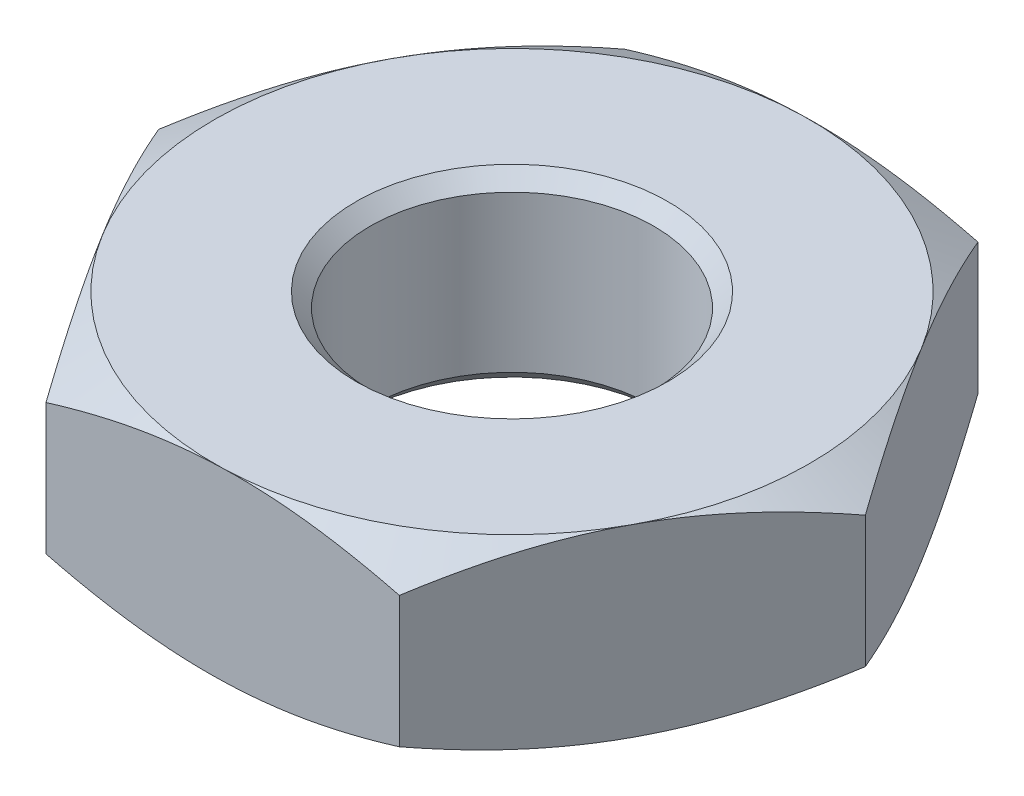
ISO-10303-21;
HEADER;
FILE_DESCRIPTION(('STEP AP214'),'2;1');
FILE_NAME('part.step','',(''),(''),'','','');
FILE_SCHEMA(('AUTOMOTIVE_DESIGN { 1 0 10303 214 1 1 1 1 }'));
ENDSEC;
DATA;
#1=APPLICATION_CONTEXT('core data for automotive mechanical design processes');
#2=APPLICATION_PROTOCOL_DEFINITION('international standard','automotive_design',2000,#1);
#3=PRODUCT_CONTEXT('',#1,'mechanical');
#4=PRODUCT('Part','Part','',(#3));
#5=PRODUCT_RELATED_PRODUCT_CATEGORY('part','',(#4));
#6=PRODUCT_DEFINITION_FORMATION('','',#4);
#7=PRODUCT_DEFINITION_CONTEXT('part definition',#1,'design');
#8=PRODUCT_DEFINITION('design','',#6,#7);
#9=PRODUCT_DEFINITION_SHAPE('','',#8);
#10=(LENGTH_UNIT() NAMED_UNIT(*) SI_UNIT(.MILLI.,.METRE.));
#11=(NAMED_UNIT(*) PLANE_ANGLE_UNIT() SI_UNIT($,.RADIAN.));
#12=(NAMED_UNIT(*) SI_UNIT($,.STERADIAN.) SOLID_ANGLE_UNIT());
#13=UNCERTAINTY_MEASURE_WITH_UNIT(LENGTH_MEASURE(1.E-05),#10,'distance_accuracy_value','');
#14=(GEOMETRIC_REPRESENTATION_CONTEXT(3) GLOBAL_UNCERTAINTY_ASSIGNED_CONTEXT((#13)) GLOBAL_UNIT_ASSIGNED_CONTEXT((#10,
#11,#12)) REPRESENTATION_CONTEXT('',''));
#15=CARTESIAN_POINT('',(0.,0.,0.));
#16=DIRECTION('',(0.,0.,1.));
#17=DIRECTION('',(1.,0.,0.));
#18=AXIS2_PLACEMENT_3D('',#15,#16,#17);
#19=CARTESIAN_POINT('',(2.4239218822574,1.3,-0.0678432657951606));
#20=DIRECTION('',(-0.851697340888521,0.,0.524034006075391));
#21=DIRECTION('',(0.524034006075391,0.,0.851697340888521));
#22=AXIS2_PLACEMENT_3D('',#19,#20,#21);
#23=PLANE('',#22);
#24=CARTESIAN_POINT('',(1.15308389308313,0.187632227821777,-2.13329955972148));
#25=CARTESIAN_POINT('',(1.20892619543021,0.156856982439616,-2.04254067791857));
#26=CARTESIAN_POINT('',(1.26525052314874,0.12886765707169,-1.95099837419582));
#27=CARTESIAN_POINT('',(1.37887456591577,0.0800111785491224,-1.76632849788295));
#28=CARTESIAN_POINT('',(1.43617630044045,0.0591613104543432,-1.67319764309649));
#29=CARTESIAN_POINT('',(1.55006959544779,0.0267043172456262,-1.48809015889092));
#30=CARTESIAN_POINT('',(1.60664362843955,0.0148811929434916,-1.39614201639674));
#31=CARTESIAN_POINT('',(1.72005799914741,0.000764873291671733,-1.21181291402827));
#32=CARTESIAN_POINT('',(1.77689792442088,-0.00154000950645407,-1.11943262448508));
#33=CARTESIAN_POINT('',(1.88311344656104,0.00324580729485996,-0.946803602858488));
#34=CARTESIAN_POINT('',(1.93250491470802,0.00916142377627841,-0.86652907564142));
#35=CARTESIAN_POINT('',(2.03096605411573,0.0279132957265613,-0.706503028396065));
#36=CARTESIAN_POINT('',(2.08003538462258,0.040755961621614,-0.626752062185187));
#37=CARTESIAN_POINT('',(2.17869965888487,0.0728627500989018,-0.466395865725309));
#38=CARTESIAN_POINT('',(2.228282110189,0.0922630208018984,-0.385810939096732));
#39=CARTESIAN_POINT('',(2.32670734985389,0.136294435017617,-0.225843238666911));
#40=CARTESIAN_POINT('',(2.37555139994362,0.160915227486347,-0.146458414214007));
#41=CARTESIAN_POINT('',(2.42404493864866,0.187632227821777,-0.0676432657951605));
#42=B_SPLINE_CURVE_WITH_KNOTS('',3,(#24,#25,#26,#27,#28,#29,#30,#31,#32,#33,#34,#35,#36,#37,#38,
#39,#40,#41),.UNSPECIFIED.,.F.,.F.,(4,2,2,2,2,2,2,2,4),(0.,0.332882891261358,0.666566106457793,
0.991990127789948,1.31701444194562,1.60005859888884,1.88336514093234,2.17295727111776,
2.46198049081544),.UNSPECIFIED.);
#43=CARTESIAN_POINT('',(1.15320694947439,0.187564434701791,-2.13309955972148));
#44=VERTEX_POINT('',#43);
#45=CARTESIAN_POINT('',(1.78856441586589,0.,-1.10047141275832));
#46=VERTEX_POINT('',#45);
#47=EDGE_CURVE('E50',#44,#46,#42,.T.);
#48=ORIENTED_EDGE('',*,*,#47,.F.);
#49=DIRECTION('',(0.,-1.,0.));
#50=VECTOR('',#49,1.);
#51=CARTESIAN_POINT('',(1.15320694947439,1.3,-2.13309955972148));
#52=LINE('',#51,#50);
#53=CARTESIAN_POINT('',(1.15320694947439,1.11243556529821,-2.13309955972148));
#54=VERTEX_POINT('',#53);
#55=EDGE_CURVE('E302',#54,#44,#52,.T.);
#56=ORIENTED_EDGE('',*,*,#55,.F.);
#57=CARTESIAN_POINT('',(2.42404493864866,1.11236777217822,-0.0676432657951605));
#58=CARTESIAN_POINT('',(2.36820263630158,1.14314301756038,-0.15840214759807));
#59=CARTESIAN_POINT('',(2.31187830858305,1.17113234292831,-0.249944451320817));
#60=CARTESIAN_POINT('',(2.19825426581602,1.21998882145088,-0.434614327633695));
#61=CARTESIAN_POINT('',(2.14095253129134,1.24083868954566,-0.527745182420155));
#62=CARTESIAN_POINT('',(2.027059236284,1.27329568275437,-0.712852666625722));
#63=CARTESIAN_POINT('',(1.97048520329225,1.28511880705651,-0.804800809119904));
#64=CARTESIAN_POINT('',(1.85707083258438,1.29923512670833,-0.989129911488374));
#65=CARTESIAN_POINT('',(1.80023090731091,1.30154000950645,-1.08151020103156));
#66=CARTESIAN_POINT('',(1.69401538517075,1.29675419270514,-1.25413922265815));
#67=CARTESIAN_POINT('',(1.64462391702377,1.29083857622372,-1.33441374987522));
#68=CARTESIAN_POINT('',(1.54616277761606,1.27208670427344,-1.49443979712058));
#69=CARTESIAN_POINT('',(1.49709344710921,1.25924403837839,-1.57419076333145));
#70=CARTESIAN_POINT('',(1.39842917284693,1.2271372499011,-1.73454695979133));
#71=CARTESIAN_POINT('',(1.34884672154279,1.2077369791981,-1.81513188641991));
#72=CARTESIAN_POINT('',(1.2504214818779,1.16370556498238,-1.97509958684973));
#73=CARTESIAN_POINT('',(1.20157743178817,1.13908477251365,-2.05448441130263));
#74=CARTESIAN_POINT('',(1.15308389308313,1.11236777217822,-2.13329955972148));
#75=B_SPLINE_CURVE_WITH_KNOTS('',3,(#57,#58,#59,#60,#61,#62,#63,#64,#65,#66,#67,#68,#69,#70,#71,
#72,#73,#74),.UNSPECIFIED.,.F.,.F.,(4,2,2,2,2,2,2,2,4),(0.,0.332882891261357,0.666566106457793,
0.991990127789948,1.31701444194562,1.60005859888884,1.88336514093234,2.17295727111776,
2.46198049081544),.UNSPECIFIED.);
#76=CARTESIAN_POINT('',(1.78856441586589,1.3,-1.10047141275832));
#77=VERTEX_POINT('',#76);
#78=EDGE_CURVE('E246',#77,#54,#75,.T.);
#79=ORIENTED_EDGE('',*,*,#78,.F.);
#80=CARTESIAN_POINT('',(2.4239218822574,1.11243556529821,-0.0678432657951606));
#81=VERTEX_POINT('',#80);
#82=EDGE_CURVE('E315',#81,#77,#75,.T.);
#83=ORIENTED_EDGE('',*,*,#82,.F.);
#84=DIRECTION('',(0.,-1.,0.));
#85=VECTOR('',#84,1.);
#86=CARTESIAN_POINT('',(2.4239218822574,1.3,-0.0678432657951606));
#87=LINE('',#86,#85);
#88=CARTESIAN_POINT('',(2.4239218822574,0.187564434701791,-0.0678432657951605));
#89=VERTEX_POINT('',#88);
#90=EDGE_CURVE('E313',#81,#89,#87,.T.);
#91=ORIENTED_EDGE('',*,*,#90,.T.);
#92=EDGE_CURVE('E137',#46,#89,#42,.T.);
#93=ORIENTED_EDGE('',*,*,#92,.F.);
#94=EDGE_LOOP('',(#48,#56,#79,#83,#91,#93));
#95=FACE_BOUND('',#94,.T.);
#96=ADVANCED_FACE('F35',(#95),#23,.F.);
#97=CARTESIAN_POINT('',(1.15320694947439,1.3,-2.13309955972148));
#98=DIRECTION('',(0.0279780912639564,0.,0.999608536582809));
#99=DIRECTION('',(0.999608536582809,0.,-0.0279780912639564));
#100=AXIS2_PLACEMENT_3D('',#97,#98,#99);
#101=PLANE('',#100);
#102=CARTESIAN_POINT('',(-1.27091493278301,0.187622195912791,-2.06525069611673));
#103=CARTESIAN_POINT('',(-1.1643948705702,0.156847774379668,-2.06823209124589));
#104=CARTESIAN_POINT('',(-1.05695533614888,0.12885932408249,-2.07123922152678));
#105=CARTESIAN_POINT('',(-0.840215748517673,0.0800046617689156,-2.07730555623815));
#106=CARTESIAN_POINT('',(-0.730911843480261,0.0591557336704143,-2.08036486847762));
#107=CARTESIAN_POINT('',(-0.51365868327104,0.0267005987689807,-2.08644557759651));
#108=CARTESIAN_POINT('',(-0.405742859662847,0.0148783984471731,-2.08946603875829));
#109=CARTESIAN_POINT('',(-0.189403301048406,0.000763864689388722,-2.09552117703833));
#110=CARTESIAN_POINT('',(-0.0809803526426981,-0.00154015543921084,-2.09855583214039));
#111=CARTESIAN_POINT('',(0.121622656128498,0.00324702501461745,-2.10422649746817));
#112=CARTESIAN_POINT('',(0.215833009454636,0.00916280861096438,-2.10686335556502));
#113=CARTESIAN_POINT('',(0.403639921550835,0.0279142285983228,-2.11211989223346));
#114=CARTESIAN_POINT('',(0.497235830488684,0.0407562736188154,-2.11473955261686));
#115=CARTESIAN_POINT('',(0.685430122960412,0.0728611238005162,-2.1200069316932));
#116=CARTESIAN_POINT('',(0.780004681366293,0.0922600521344988,-2.12265398354349));
#117=CARTESIAN_POINT('',(0.96774305037703,0.13628827152943,-2.12790860175622));
#118=CARTESIAN_POINT('',(1.06090926713312,0.160907214081484,-2.13051623546454));
#119=CARTESIAN_POINT('',(1.15340694947439,0.187622195912791,-2.13310515753107));
#120=B_SPLINE_CURVE_WITH_KNOTS('',3,(#102,#103,#104,#105,#106,#107,#108,#109,#110,#111,#112,
#113,#114,#115,#116,#117,#118,#119),.UNSPECIFIED.,.F.,.F.,(4,2,2,2,2,2,2,2,4),(0.,
0.332880511908961,0.666561282594564,0.9919831519132,1.31700534002341,1.60003412037819,
1.88332522783748,2.17290110651847,2.46190819001168),.UNSPECIFIED.);
#121=CARTESIAN_POINT('',(-1.27071493278301,0.187564434701791,-2.06525629392632));
#122=VERTEX_POINT('',#121);
#123=CARTESIAN_POINT('',(-0.0587539916543081,0.,-2.09917792682389));
#124=VERTEX_POINT('',#123);
#125=EDGE_CURVE('E58',#122,#124,#120,.T.);
#126=ORIENTED_EDGE('',*,*,#125,.F.);
#127=DIRECTION('',(0.,-1.,0.));
#128=VECTOR('',#127,1.);
#129=CARTESIAN_POINT('',(-1.27071493278301,1.3,-2.06525629392632));
#130=LINE('',#129,#128);
#131=CARTESIAN_POINT('',(-1.27071493278301,1.11243556529821,-2.06525629392632));
#132=VERTEX_POINT('',#131);
#133=EDGE_CURVE('E305',#132,#122,#130,.T.);
#134=ORIENTED_EDGE('',*,*,#133,.F.);
#135=CARTESIAN_POINT('',(1.15340694947439,1.11237780408721,-2.13310515753107));
#136=CARTESIAN_POINT('',(1.04688688726158,1.14315222562033,-2.13012376240191));
#137=CARTESIAN_POINT('',(0.939447352840265,1.17114067591751,-2.12711663212102));
#138=CARTESIAN_POINT('',(0.722707765209056,1.21999533823108,-2.12105029740965));
#139=CARTESIAN_POINT('',(0.613403860171644,1.24084426632959,-2.11799098517018));
#140=CARTESIAN_POINT('',(0.396150699962423,1.27329940123102,-2.11191027605129));
#141=CARTESIAN_POINT('',(0.28823487635423,1.28512160155283,-2.10888981488951));
#142=CARTESIAN_POINT('',(0.0718953177397893,1.29923613531061,-2.10283467660947));
#143=CARTESIAN_POINT('',(-0.0365276306659187,1.30154015543921,-2.09980002150741));
#144=CARTESIAN_POINT('',(-0.239130639437114,1.29675297498538,-2.09412935617963));
#145=CARTESIAN_POINT('',(-0.333340992763253,1.29083719138904,-2.09149249808278));
#146=CARTESIAN_POINT('',(-0.521147904859451,1.27208577140168,-2.08623596141434));
#147=CARTESIAN_POINT('',(-0.614743813797301,1.25924372638118,-2.08361630103094));
#148=CARTESIAN_POINT('',(-0.802938106269029,1.22713887619948,-2.0783489219546));
#149=CARTESIAN_POINT('',(-0.897512664674909,1.2077399478655,-2.07570187010431));
#150=CARTESIAN_POINT('',(-1.08525103368565,1.16371172847057,-2.07044725189158));
#151=CARTESIAN_POINT('',(-1.17841725044174,1.13909278591852,-2.06783961818326));
#152=CARTESIAN_POINT('',(-1.27091493278301,1.11237780408721,-2.06525069611673));
#153=B_SPLINE_CURVE_WITH_KNOTS('',3,(#135,#136,#137,#138,#139,#140,#141,#142,#143,#144,#145,
#146,#147,#148,#149,#150,#151,#152),.UNSPECIFIED.,.F.,.F.,(4,2,2,2,2,2,2,2,4),(0.,
0.332880511908961,0.666561282594564,0.9919831519132,1.31700534002341,1.60003412037819,
1.88332522783748,2.17290110651847,2.46190819001168),.UNSPECIFIED.);
#154=CARTESIAN_POINT('',(-0.0587539916543084,1.3,-2.0991779268239));
#155=VERTEX_POINT('',#154);
#156=EDGE_CURVE('E240',#155,#132,#153,.T.);
#157=ORIENTED_EDGE('',*,*,#156,.F.);
#158=EDGE_CURVE('E245',#54,#155,#153,.T.);
#159=ORIENTED_EDGE('',*,*,#158,.F.);
#160=ORIENTED_EDGE('',*,*,#55,.T.);
#161=EDGE_CURVE('E164',#124,#44,#120,.T.);
#162=ORIENTED_EDGE('',*,*,#161,.F.);
#163=EDGE_LOOP('',(#126,#134,#157,#159,#160,#162));
#164=FACE_BOUND('',#163,.T.);
#165=ADVANCED_FACE('F251',(#164),#101,.F.);
#166=CARTESIAN_POINT('',(-1.27071493278301,1.3,-2.06525629392632));
#167=DIRECTION('',(0.879675432152478,0.,0.475574530507419));
#168=DIRECTION('',(0.475574530507419,0.,-0.879675432152478));
#169=AXIS2_PLACEMENT_3D('',#166,#167,#168);
#170=PLANE('',#169);
#171=CARTESIAN_POINT('',(-2.4240300072574,0.187630071508909,0.0680432657951608));
#172=CARTESIAN_POINT('',(-2.3733517211191,0.156855003207588,-0.0256969166571895));
#173=CARTESIAN_POINT('',(-2.32223598476669,0.128865865930236,-0.120246255574942));
#174=CARTESIAN_POINT('',(-2.2191193285457,0.0800097777897679,-0.310982267081977));
#175=CARTESIAN_POINT('',(-2.16711657598826,0.0591601117410563,-0.407172329615978));
#176=CARTESIAN_POINT('',(-2.06375556971956,0.0267035179636209,-0.598360318089878));
#177=CARTESIAN_POINT('',(-2.01241322239942,0.0148805922652686,-0.693328821803427));
#178=CARTESIAN_POINT('',(-1.90948685661841,0.000764656480634456,-0.883712850993748));
#179=CARTESIAN_POINT('',(-1.8579032124452,-0.00154004089162805,-0.979127684146513));
#180=CARTESIAN_POINT('',(-1.761510455679,0.0032460690250231,-1.15742642498573));
#181=CARTESIAN_POINT('',(-1.71668693763648,0.00916172143131204,-1.24033697859039));
#182=CARTESIAN_POINT('',(-1.62733193638672,0.0279134962403989,-1.40561790575758));
#183=CARTESIAN_POINT('',(-1.58280076240565,0.0407560286831647,-1.48798770734107));
#184=CARTESIAN_POINT('',(-1.4932614216795,0.0728624005347126,-1.65360960926228));
#185=CARTESIAN_POINT('',(-1.44826459169465,0.0922623827015824,-1.73684073987009));
#186=CARTESIAN_POINT('',(-1.35894217688078,0.136293110204638,-1.90206139154893));
#187=CARTESIAN_POINT('',(-1.31461544706421,0.160913505041771,-1.984053030516));
#188=CARTESIAN_POINT('',(-1.27060680778301,0.18763007150891,-2.06545629392632));
#189=B_SPLINE_CURVE_WITH_KNOTS('',3,(#171,#172,#173,#174,#175,#176,#177,#178,#179,#180,#181,
#182,#183,#184,#185,#186,#187,#188),.UNSPECIFIED.,.F.,.F.,(4,2,2,2,2,2,2,2,4),(0.,
0.332882379830728,0.666565069591033,0.991988628357672,1.31701248552958,1.60005333737767,
1.88335656185959,2.17294519888667,2.46196495021022),.UNSPECIFIED.);
#190=CARTESIAN_POINT('',(-2.4239218822574,0.18756443470179,0.0678432657951609));
#191=VERTEX_POINT('',#190);
#192=CARTESIAN_POINT('',(-1.84731840752019,0.,-0.998706514065575));
#193=VERTEX_POINT('',#192);
#194=EDGE_CURVE('E347',#191,#193,#189,.T.);
#195=ORIENTED_EDGE('',*,*,#194,.F.);
#196=DIRECTION('',(0.,-1.,0.));
#197=VECTOR('',#196,1.);
#198=CARTESIAN_POINT('',(-2.4239218822574,1.3,0.0678432657951608));
#199=LINE('',#198,#197);
#200=CARTESIAN_POINT('',(-2.4239218822574,1.11243556529821,0.0678432657951608));
#201=VERTEX_POINT('',#200);
#202=EDGE_CURVE('E308',#201,#191,#199,.T.);
#203=ORIENTED_EDGE('',*,*,#202,.F.);
#204=CARTESIAN_POINT('',(-1.27060680778301,1.11236992849109,-2.06545629392632));
#205=CARTESIAN_POINT('',(-1.32128509392131,1.14314499679241,-1.97171611147397));
#206=CARTESIAN_POINT('',(-1.37240083027372,1.17113413406976,-1.87716677255622));
#207=CARTESIAN_POINT('',(-1.4755174864947,1.21999022221023,-1.68643076104918));
#208=CARTESIAN_POINT('',(-1.52752023905215,1.24083988825894,-1.59024069851518));
#209=CARTESIAN_POINT('',(-1.63088124532085,1.27329648203638,-1.39905271004128));
#210=CARTESIAN_POINT('',(-1.68222359264098,1.28511940773473,-1.30408420632773));
#211=CARTESIAN_POINT('',(-1.785149958422,1.29923534351937,-1.11370017713741));
#212=CARTESIAN_POINT('',(-1.83673360259521,1.30154004089163,-1.01828534398465));
#213=CARTESIAN_POINT('',(-1.93312635936141,1.29675393097498,-0.839986603145431));
#214=CARTESIAN_POINT('',(-1.97794987740392,1.29083827856869,-0.757076049540771));
#215=CARTESIAN_POINT('',(-2.06730487865369,1.2720865037596,-0.591795122373575));
#216=CARTESIAN_POINT('',(-2.11183605263475,1.25924397131684,-0.509425320790095));
#217=CARTESIAN_POINT('',(-2.20137539336091,1.22713759946529,-0.343803418868875));
#218=CARTESIAN_POINT('',(-2.24637222334576,1.20773761729842,-0.260572288261066));
#219=CARTESIAN_POINT('',(-2.33569463815962,1.16370688979536,-0.095351636582233));
#220=CARTESIAN_POINT('',(-2.3800213679762,1.13908649495823,-0.0133599976151586));
#221=CARTESIAN_POINT('',(-2.4240300072574,1.11236992849109,0.0680432657951605));
#222=B_SPLINE_CURVE_WITH_KNOTS('',3,(#204,#205,#206,#207,#208,#209,#210,#211,#212,#213,#214,
#215,#216,#217,#218,#219,#220,#221),.UNSPECIFIED.,.F.,.F.,(4,2,2,2,2,2,2,2,4),(0.,
0.332882379830727,0.666565069591033,0.991988628357672,1.31701248552958,1.60005333737767,
1.88335656185959,2.17294519888667,2.46196495021022),.UNSPECIFIED.);
#223=CARTESIAN_POINT('',(-1.8473184075202,1.3,-0.99870651406558));
#224=VERTEX_POINT('',#223);
#225=EDGE_CURVE('E234',#224,#201,#222,.T.);
#226=ORIENTED_EDGE('',*,*,#225,.F.);
#227=EDGE_CURVE('E239',#132,#224,#222,.T.);
#228=ORIENTED_EDGE('',*,*,#227,.F.);
#229=ORIENTED_EDGE('',*,*,#133,.T.);
#230=EDGE_CURVE('E197',#193,#122,#189,.T.);
#231=ORIENTED_EDGE('',*,*,#230,.F.);
#232=EDGE_LOOP('',(#195,#203,#226,#228,#229,#231));
#233=FACE_BOUND('',#232,.T.);
#234=ADVANCED_FACE('F217',(#233),#170,.F.);
#235=CARTESIAN_POINT('',(-2.4239218822574,1.3,0.0678432657951608));
#236=DIRECTION('',(0.851697340888521,0.,-0.524034006075391));
#237=DIRECTION('',(-0.524034006075391,0.,-0.851697340888521));
#238=AXIS2_PLACEMENT_3D('',#235,#236,#237);
#239=PLANE('',#238);
#240=CARTESIAN_POINT('',(-1.15308389308313,0.187632227821777,2.13329955972148));
#241=CARTESIAN_POINT('',(-1.20892619543021,0.156856982439616,2.04254067791857));
#242=CARTESIAN_POINT('',(-1.26525052314873,0.12886765707169,1.95099837419583));
#243=CARTESIAN_POINT('',(-1.37887456591577,0.0800111785491222,1.76632849788295));
#244=CARTESIAN_POINT('',(-1.43617630044045,0.0591613104543428,1.67319764309649));
#245=CARTESIAN_POINT('',(-1.55006959544779,0.0267043172456258,1.48809015889092));
#246=CARTESIAN_POINT('',(-1.60664362843954,0.0148811929434913,1.39614201639674));
#247=CARTESIAN_POINT('',(-1.7200579991474,0.000764873291671378,1.21181291402827));
#248=CARTESIAN_POINT('',(-1.77689792442088,-0.00154000950645462,1.11943262448509));
#249=CARTESIAN_POINT('',(-1.88311344656104,0.00324580729485926,0.946803602858489));
#250=CARTESIAN_POINT('',(-1.93250491470802,0.00916142377627775,0.866529075641421));
#251=CARTESIAN_POINT('',(-2.03096605411573,0.0279132957265606,0.706503028396065));
#252=CARTESIAN_POINT('',(-2.08003538462258,0.0407559616216133,0.626752062185187));
#253=CARTESIAN_POINT('',(-2.17869965888486,0.0728627500989012,0.466395865725309));
#254=CARTESIAN_POINT('',(-2.228282110189,0.0922630208018979,0.385810939096733));
#255=CARTESIAN_POINT('',(-2.32670734985389,0.136294435017617,0.225843238666911));
#256=CARTESIAN_POINT('',(-2.37555139994362,0.160915227486347,0.146458414214007));
#257=CARTESIAN_POINT('',(-2.42404493864866,0.187632227821777,0.0676432657951609));
#258=B_SPLINE_CURVE_WITH_KNOTS('',3,(#240,#241,#242,#243,#244,#245,#246,#247,#248,#249,#250,
#251,#252,#253,#254,#255,#256,#257),.UNSPECIFIED.,.F.,.F.,(4,2,2,2,2,2,2,2,4),(0.,
0.332882891261358,0.666566106457793,0.991990127789948,1.31701444194562,1.60005859888884,
1.88336514093234,2.17295727111776,2.46198049081544),.UNSPECIFIED.);
#259=CARTESIAN_POINT('',(-1.15320694947439,0.187564434701791,2.13309955972148));
#260=VERTEX_POINT('',#259);
#261=CARTESIAN_POINT('',(-1.78856441586589,0.,1.10047141275832));
#262=VERTEX_POINT('',#261);
#263=EDGE_CURVE('E147',#260,#262,#258,.T.);
#264=ORIENTED_EDGE('',*,*,#263,.F.);
#265=DIRECTION('',(0.,-1.,0.));
#266=VECTOR('',#265,1.);
#267=CARTESIAN_POINT('',(-1.15320694947439,1.3,2.13309955972148));
#268=LINE('',#267,#266);
#269=CARTESIAN_POINT('',(-1.15320694947439,1.11243556529821,2.13309955972148));
#270=VERTEX_POINT('',#269);
#271=EDGE_CURVE('E163',#270,#260,#268,.T.);
#272=ORIENTED_EDGE('',*,*,#271,.F.);
#273=CARTESIAN_POINT('',(-2.42404493864866,1.11236777217822,0.0676432657951608));
#274=CARTESIAN_POINT('',(-2.36820263630158,1.14314301756038,0.15840214759807));
#275=CARTESIAN_POINT('',(-2.31187830858305,1.17113234292831,0.249944451320817));
#276=CARTESIAN_POINT('',(-2.19825426581602,1.21998882145088,0.434614327633695));
#277=CARTESIAN_POINT('',(-2.14095253129134,1.24083868954566,0.527745182420155));
#278=CARTESIAN_POINT('',(-2.027059236284,1.27329568275437,0.712852666625722));
#279=CARTESIAN_POINT('',(-1.97048520329224,1.28511880705651,0.804800809119904));
#280=CARTESIAN_POINT('',(-1.85707083258438,1.29923512670833,0.989129911488373));
#281=CARTESIAN_POINT('',(-1.80023090731091,1.30154000950645,1.08151020103156));
#282=CARTESIAN_POINT('',(-1.69401538517075,1.29675419270514,1.25413922265815));
#283=CARTESIAN_POINT('',(-1.64462391702376,1.29083857622372,1.33441374987522));
#284=CARTESIAN_POINT('',(-1.54616277761606,1.27208670427344,1.49443979712058));
#285=CARTESIAN_POINT('',(-1.49709344710921,1.25924403837839,1.57419076333145));
#286=CARTESIAN_POINT('',(-1.39842917284692,1.2271372499011,1.73454695979133));
#287=CARTESIAN_POINT('',(-1.34884672154279,1.2077369791981,1.81513188641991));
#288=CARTESIAN_POINT('',(-1.25042148187789,1.16370556498238,1.97509958684973));
#289=CARTESIAN_POINT('',(-1.20157743178817,1.13908477251365,2.05448441130264));
#290=CARTESIAN_POINT('',(-1.15308389308313,1.11236777217822,2.13329955972148));
#291=B_SPLINE_CURVE_WITH_KNOTS('',3,(#273,#274,#275,#276,#277,#278,#279,#280,#281,#282,#283,
#284,#285,#286,#287,#288,#289,#290),.UNSPECIFIED.,.F.,.F.,(4,2,2,2,2,2,2,2,4),(0.,
0.332882891261357,0.666566106457792,0.991990127789947,1.31701444194562,1.60005859888884,
1.88336514093234,2.17295727111776,2.46198049081544),.UNSPECIFIED.);
#292=CARTESIAN_POINT('',(-1.78856441586589,1.3,1.10047141275832));
#293=VERTEX_POINT('',#292);
#294=EDGE_CURVE('E222',#293,#270,#291,.T.);
#295=ORIENTED_EDGE('',*,*,#294,.F.);
#296=EDGE_CURVE('E228',#201,#293,#291,.T.);
#297=ORIENTED_EDGE('',*,*,#296,.F.);
#298=ORIENTED_EDGE('',*,*,#202,.T.);
#299=EDGE_CURVE('E166',#262,#191,#258,.T.);
#300=ORIENTED_EDGE('',*,*,#299,.F.);
#301=EDGE_LOOP('',(#264,#272,#295,#297,#298,#300));
#302=FACE_BOUND('',#301,.T.);
#303=ADVANCED_FACE('F214',(#302),#239,.F.);
#304=CARTESIAN_POINT('',(-1.15320694947439,1.3,2.13309955972148));
#305=DIRECTION('',(-0.0279780912639567,0.,-0.999608536582809));
#306=DIRECTION('',(-0.999608536582809,0.,0.0279780912639567));
#307=AXIS2_PLACEMENT_3D('',#304,#305,#306);
#308=PLANE('',#307);
#309=CARTESIAN_POINT('',(1.27091493278301,0.187622195912791,2.06525069611673));
#310=CARTESIAN_POINT('',(1.1643948705702,0.156847774379668,2.06823209124589));
#311=CARTESIAN_POINT('',(1.05695533614888,0.12885932408249,2.07123922152678));
#312=CARTESIAN_POINT('',(0.840215748517674,0.0800046617689157,2.07730555623815));
#313=CARTESIAN_POINT('',(0.730911843480262,0.0591557336704144,2.08036486847762));
#314=CARTESIAN_POINT('',(0.513658683271041,0.0267005987689808,2.08644557759651));
#315=CARTESIAN_POINT('',(0.405742859662848,0.0148783984471731,2.08946603875829));
#316=CARTESIAN_POINT('',(0.189403301048407,0.000763864689388645,2.09552117703833));
#317=CARTESIAN_POINT('',(0.0809803526426993,-0.00154015543921088,2.09855583214039));
#318=CARTESIAN_POINT('',(-0.121622656128496,0.00324702501461751,2.10422649746817));
#319=CARTESIAN_POINT('',(-0.215833009454635,0.00916280861096449,2.10686335556502));
#320=CARTESIAN_POINT('',(-0.403639921550833,0.0279142285983228,2.11211989223346));
#321=CARTESIAN_POINT('',(-0.497235830488683,0.0407562736188153,2.11473955261686));
#322=CARTESIAN_POINT('',(-0.68543012296041,0.072861123800516,2.1200069316932));
#323=CARTESIAN_POINT('',(-0.780004681366291,0.0922600521344987,2.12265398354349));
#324=CARTESIAN_POINT('',(-0.967743050377029,0.13628827152943,2.12790860175622));
#325=CARTESIAN_POINT('',(-1.06090926713312,0.160907214081484,2.13051623546454));
#326=CARTESIAN_POINT('',(-1.15340694947439,0.18762219591279,2.13310515753107));
#327=B_SPLINE_CURVE_WITH_KNOTS('',3,(#309,#310,#311,#312,#313,#314,#315,#316,#317,#318,#319,
#320,#321,#322,#323,#324,#325,#326),.UNSPECIFIED.,.F.,.F.,(4,2,2,2,2,2,2,2,4),(0.,
0.332880511908961,0.666561282594564,0.9919831519132,1.31700534002341,1.60003412037819,
1.88332522783748,2.17290110651847,2.46190819001168),.UNSPECIFIED.);
#328=CARTESIAN_POINT('',(1.27071493278301,0.187564434701791,2.06525629392632));
#329=VERTEX_POINT('',#328);
#330=CARTESIAN_POINT('',(0.0587539916543089,0.,2.09917792682389));
#331=VERTEX_POINT('',#330);
#332=EDGE_CURVE('E125',#329,#331,#327,.T.);
#333=ORIENTED_EDGE('',*,*,#332,.F.);
#334=DIRECTION('',(0.,-1.,0.));
#335=VECTOR('',#334,1.);
#336=CARTESIAN_POINT('',(1.27071493278301,1.3,2.06525629392632));
#337=LINE('',#336,#335);
#338=CARTESIAN_POINT('',(1.27071493278301,1.11243556529821,2.06525629392632));
#339=VERTEX_POINT('',#338);
#340=EDGE_CURVE('E312',#339,#329,#337,.T.);
#341=ORIENTED_EDGE('',*,*,#340,.F.);
#342=CARTESIAN_POINT('',(-1.15340694947439,1.11237780408721,2.13310515753107));
#343=CARTESIAN_POINT('',(-1.04688688726158,1.14315222562033,2.13012376240191));
#344=CARTESIAN_POINT('',(-0.939447352840264,1.17114067591751,2.12711663212102));
#345=CARTESIAN_POINT('',(-0.722707765209055,1.21999533823108,2.12105029740965));
#346=CARTESIAN_POINT('',(-0.613403860171642,1.24084426632959,2.11799098517018));
#347=CARTESIAN_POINT('',(-0.396150699962422,1.27329940123102,2.11191027605129));
#348=CARTESIAN_POINT('',(-0.288234876354229,1.28512160155283,2.10888981488951));
#349=CARTESIAN_POINT('',(-0.0718953177397882,1.29923613531061,2.10283467660947));
#350=CARTESIAN_POINT('',(0.0365276306659198,1.30154015543921,2.09980002150741));
#351=CARTESIAN_POINT('',(0.239130639437116,1.29675297498538,2.09412935617963));
#352=CARTESIAN_POINT('',(0.333340992763254,1.29083719138904,2.09149249808278));
#353=CARTESIAN_POINT('',(0.521147904859453,1.27208577140168,2.08623596141434));
#354=CARTESIAN_POINT('',(0.614743813797302,1.25924372638118,2.08361630103094));
#355=CARTESIAN_POINT('',(0.80293810626903,1.22713887619948,2.0783489219546));
#356=CARTESIAN_POINT('',(0.89751266467491,1.2077399478655,2.07570187010431));
#357=CARTESIAN_POINT('',(1.08525103368565,1.16371172847057,2.07044725189158));
#358=CARTESIAN_POINT('',(1.17841725044174,1.13909278591852,2.06783961818326));
#359=CARTESIAN_POINT('',(1.27091493278301,1.11237780408721,2.06525069611673));
#360=B_SPLINE_CURVE_WITH_KNOTS('',3,(#342,#343,#344,#345,#346,#347,#348,#349,#350,#351,#352,
#353,#354,#355,#356,#357,#358,#359),.UNSPECIFIED.,.F.,.F.,(4,2,2,2,2,2,2,2,4),(0.,
0.332880511908961,0.666561282594564,0.9919831519132,1.31700534002341,1.60003412037819,
1.88332522783748,2.17290110651847,2.46190819001168),.UNSPECIFIED.);
#361=CARTESIAN_POINT('',(0.0587539916543089,1.3,2.0991779268239));
#362=VERTEX_POINT('',#361);
#363=EDGE_CURVE('E230',#362,#339,#360,.T.);
#364=ORIENTED_EDGE('',*,*,#363,.F.);
#365=EDGE_CURVE('E229',#270,#362,#360,.T.);
#366=ORIENTED_EDGE('',*,*,#365,.F.);
#367=ORIENTED_EDGE('',*,*,#271,.T.);
#368=EDGE_CURVE('E140',#331,#260,#327,.T.);
#369=ORIENTED_EDGE('',*,*,#368,.F.);
#370=EDGE_LOOP('',(#333,#341,#364,#366,#367,#369));
#371=FACE_BOUND('',#370,.T.);
#372=ADVANCED_FACE('F160',(#371),#308,.F.);
#373=CARTESIAN_POINT('',(1.27071493278301,1.3,2.06525629392632));
#374=DIRECTION('',(-0.879675432152478,0.,-0.475574530507419));
#375=DIRECTION('',(-0.475574530507419,0.,0.879675432152478));
#376=AXIS2_PLACEMENT_3D('',#373,#374,#375);
#377=PLANE('',#376);
#378=CARTESIAN_POINT('',(2.4240300072574,0.18763007150891,-0.0680432657951606));
#379=CARTESIAN_POINT('',(2.3733517211191,0.156855003207589,0.0256969166571903));
#380=CARTESIAN_POINT('',(2.32223598476669,0.128865865930237,0.120246255574943));
#381=CARTESIAN_POINT('',(2.2191193285457,0.0800097777897684,0.310982267081978));
#382=CARTESIAN_POINT('',(2.16711657598826,0.0591601117410567,0.407172329615978));
#383=CARTESIAN_POINT('',(2.06375556971956,0.026703517963621,0.598360318089879));
#384=CARTESIAN_POINT('',(2.01241322239943,0.0148805922652688,0.693328821803427));
#385=CARTESIAN_POINT('',(1.90948685661841,0.000764656480634777,0.883712850993749));
#386=CARTESIAN_POINT('',(1.8579032124452,-0.00154004089162758,0.979127684146514));
#387=CARTESIAN_POINT('',(1.761510455679,0.00324606902502363,1.15742642498573));
#388=CARTESIAN_POINT('',(1.71668693763648,0.00916172143131247,1.24033697859039));
#389=CARTESIAN_POINT('',(1.62733193638672,0.0279134962403992,1.40561790575758));
#390=CARTESIAN_POINT('',(1.58280076240565,0.0407560286831651,1.48798770734107));
#391=CARTESIAN_POINT('',(1.4932614216795,0.072862400534713,1.65360960926228));
#392=CARTESIAN_POINT('',(1.44826459169465,0.0922623827015828,1.73684073987009));
#393=CARTESIAN_POINT('',(1.35894217688078,0.136293110204639,1.90206139154893));
#394=CARTESIAN_POINT('',(1.31461544706421,0.160913505041771,1.984053030516));
#395=CARTESIAN_POINT('',(1.27060680778301,0.18763007150891,2.06545629392632));
#396=B_SPLINE_CURVE_WITH_KNOTS('',3,(#378,#379,#380,#381,#382,#383,#384,#385,#386,#387,#388,
#389,#390,#391,#392,#393,#394,#395),.UNSPECIFIED.,.F.,.F.,(4,2,2,2,2,2,2,2,4),(0.,
0.332882379830728,0.666565069591033,0.991988628357672,1.31701248552958,1.60005333737767,
1.88335656185959,2.17294519888667,2.46196495021021),.UNSPECIFIED.);
#397=CARTESIAN_POINT('',(1.8473184075202,0.,0.99870651406558));
#398=VERTEX_POINT('',#397);
#399=EDGE_CURVE('E138',#89,#398,#396,.T.);
#400=ORIENTED_EDGE('',*,*,#399,.F.);
#401=ORIENTED_EDGE('',*,*,#90,.F.);
#402=CARTESIAN_POINT('',(1.27060680778301,1.11236992849109,2.06545629392632));
#403=CARTESIAN_POINT('',(1.32128509392131,1.14314499679241,1.97171611147397));
#404=CARTESIAN_POINT('',(1.37240083027372,1.17113413406976,1.87716677255622));
#405=CARTESIAN_POINT('',(1.47551748649471,1.21999022221023,1.68643076104918));
#406=CARTESIAN_POINT('',(1.52752023905215,1.24083988825894,1.59024069851518));
#407=CARTESIAN_POINT('',(1.63088124532085,1.27329648203638,1.39905271004128));
#408=CARTESIAN_POINT('',(1.68222359264098,1.28511940773473,1.30408420632773));
#409=CARTESIAN_POINT('',(1.785149958422,1.29923534351937,1.11370017713741));
#410=CARTESIAN_POINT('',(1.83673360259521,1.30154004089163,1.01828534398465));
#411=CARTESIAN_POINT('',(1.93312635936141,1.29675393097498,0.839986603145431));
#412=CARTESIAN_POINT('',(1.97794987740392,1.29083827856869,0.757076049540771));
#413=CARTESIAN_POINT('',(2.06730487865369,1.2720865037596,0.591795122373575));
#414=CARTESIAN_POINT('',(2.11183605263475,1.25924397131683,0.509425320790095));
#415=CARTESIAN_POINT('',(2.20137539336091,1.22713759946529,0.343803418868875));
#416=CARTESIAN_POINT('',(2.24637222334576,1.20773761729842,0.260572288261066));
#417=CARTESIAN_POINT('',(2.33569463815962,1.16370688979536,0.0953516365822328));
#418=CARTESIAN_POINT('',(2.3800213679762,1.13908649495823,0.0133599976151582));
#419=CARTESIAN_POINT('',(2.4240300072574,1.11236992849109,-0.0680432657951606));
#420=B_SPLINE_CURVE_WITH_KNOTS('',3,(#402,#403,#404,#405,#406,#407,#408,#409,#410,#411,#412,
#413,#414,#415,#416,#417,#418,#419),.UNSPECIFIED.,.F.,.F.,(4,2,2,2,2,2,2,2,4),(0.,
0.332882379830728,0.666565069591033,0.991988628357672,1.31701248552958,1.60005333737767,
1.88335656185959,2.17294519888667,2.46196495021021),.UNSPECIFIED.);
#421=CARTESIAN_POINT('',(1.8473184075202,1.3,0.99870651406558));
#422=VERTEX_POINT('',#421);
#423=EDGE_CURVE('E297',#422,#81,#420,.T.);
#424=ORIENTED_EDGE('',*,*,#423,.F.);
#425=EDGE_CURVE('E152',#339,#422,#420,.T.);
#426=ORIENTED_EDGE('',*,*,#425,.F.);
#427=ORIENTED_EDGE('',*,*,#340,.T.);
#428=EDGE_CURVE('E132',#398,#329,#396,.T.);
#429=ORIENTED_EDGE('',*,*,#428,.F.);
#430=EDGE_LOOP('',(#400,#401,#424,#426,#427,#429));
#431=FACE_BOUND('',#430,.T.);
#432=ADVANCED_FACE('F285',(#431),#377,.F.);
#433=CARTESIAN_POINT('',(0.,0.,0.));
#434=DIRECTION('',(0.,1.,0.));
#435=DIRECTION('',(0.,0.,1.));
#436=AXIS2_PLACEMENT_3D('',#433,#434,#435);
#437=PLANE('',#436);
#438=CARTESIAN_POINT('',(0.,0.,0.));
#439=DIRECTION('',(0.,1.,0.));
#440=DIRECTION('',(0.,0.,1.));
#441=AXIS2_PLACEMENT_3D('',#438,#439,#440);
#442=CIRCLE('',#441,1.1);
#443=CARTESIAN_POINT('',(0.,0.,1.1));
#444=VERTEX_POINT('',#443);
#445=EDGE_CURVE('E43',#444,#444,#442,.T.);
#446=ORIENTED_EDGE('',*,*,#445,.T.);
#447=EDGE_LOOP('',(#446));
#448=FACE_BOUND('',#447,.T.);
#449=CARTESIAN_POINT('',(0.,0.,0.));
#450=DIRECTION('',(0.,1.,0.));
#451=DIRECTION('',(0.,0.,1.));
#452=AXIS2_PLACEMENT_3D('',#449,#450,#451);
#453=CIRCLE('',#452,2.09999999999999);
#454=EDGE_CURVE('E129',#331,#398,#453,.T.);
#455=ORIENTED_EDGE('',*,*,#454,.F.);
#456=EDGE_CURVE('E144',#262,#331,#453,.T.);
#457=ORIENTED_EDGE('',*,*,#456,.F.);
#458=EDGE_CURVE('E151',#193,#262,#453,.T.);
#459=ORIENTED_EDGE('',*,*,#458,.F.);
#460=EDGE_CURVE('E520',#124,#193,#453,.T.);
#461=ORIENTED_EDGE('',*,*,#460,.F.);
#462=EDGE_CURVE('E158',#46,#124,#453,.T.);
#463=ORIENTED_EDGE('',*,*,#462,.F.);
#464=CARTESIAN_POINT('',(0.,0.,0.));
#465=DIRECTION('',(0.,-1.,0.));
#466=DIRECTION('',(0.,0.,-1.));
#467=AXIS2_PLACEMENT_3D('',#464,#465,#466);
#468=CIRCLE('',#467,2.09999999999999);
#469=EDGE_CURVE('E156',#46,#398,#468,.T.);
#470=ORIENTED_EDGE('',*,*,#469,.T.);
#471=EDGE_LOOP('',(#455,#457,#459,#461,#463,#470));
#472=FACE_BOUND('',#471,.T.);
#473=ADVANCED_FACE('F154',(#448,#472),#437,.F.);
#474=CARTESIAN_POINT('',(0.,1.3,0.));
#475=DIRECTION('',(0.,1.,0.));
#476=DIRECTION('',(0.,0.,1.));
#477=AXIS2_PLACEMENT_3D('',#474,#475,#476);
#478=PLANE('',#477);
#479=CARTESIAN_POINT('',(0.,1.3,0.));
#480=DIRECTION('',(0.,1.,0.));
#481=DIRECTION('',(0.,0.,1.));
#482=AXIS2_PLACEMENT_3D('',#479,#480,#481);
#483=CIRCLE('',#482,1.1);
#484=CARTESIAN_POINT('',(0.,1.3,1.1));
#485=VERTEX_POINT('',#484);
#486=EDGE_CURVE('E272',#485,#485,#483,.F.);
#487=ORIENTED_EDGE('',*,*,#486,.T.);
#488=EDGE_LOOP('',(#487));
#489=FACE_BOUND('',#488,.T.);
#490=CARTESIAN_POINT('',(0.,1.3,0.));
#491=DIRECTION('',(0.,1.,0.));
#492=DIRECTION('',(0.,0.,1.));
#493=AXIS2_PLACEMENT_3D('',#490,#491,#492);
#494=CIRCLE('',#493,2.09999999999999);
#495=EDGE_CURVE('E345',#293,#362,#494,.T.);
#496=ORIENTED_EDGE('',*,*,#495,.T.);
#497=EDGE_CURVE('E343',#362,#422,#494,.T.);
#498=ORIENTED_EDGE('',*,*,#497,.T.);
#499=EDGE_CURVE('E342',#422,#77,#494,.T.);
#500=ORIENTED_EDGE('',*,*,#499,.T.);
#501=EDGE_CURVE('E329',#77,#155,#494,.T.);
#502=ORIENTED_EDGE('',*,*,#501,.T.);
#503=EDGE_CURVE('E340',#155,#224,#494,.T.);
#504=ORIENTED_EDGE('',*,*,#503,.T.);
#505=EDGE_CURVE('E344',#224,#293,#494,.T.);
#506=ORIENTED_EDGE('',*,*,#505,.T.);
#507=EDGE_LOOP('',(#496,#498,#500,#502,#504,#506));
#508=FACE_BOUND('',#507,.T.);
#509=ADVANCED_FACE('F284',(#489,#508),#478,.T.);
#510=CARTESIAN_POINT('',(0.,1.3,0.));
#511=DIRECTION('',(0.,-1.,0.));
#512=DIRECTION('',(0.,0.,-1.));
#513=AXIS2_PLACEMENT_3D('',#510,#511,#512);
#514=CYLINDRICAL_SURFACE('',#513,1.);
#515=CARTESIAN_POINT('',(0.,0.100000000000001,0.));
#516=DIRECTION('',(0.,1.,0.));
#517=DIRECTION('',(0.,0.,1.));
#518=AXIS2_PLACEMENT_3D('',#515,#516,#517);
#519=CIRCLE('',#518,1.);
#520=CARTESIAN_POINT('',(0.,0.100000000000001,1.));
#521=VERTEX_POINT('',#520);
#522=EDGE_CURVE('E12',#521,#521,#519,.F.);
#523=ORIENTED_EDGE('',*,*,#522,.T.);
#524=EDGE_LOOP('',(#523));
#525=FACE_BOUND('',#524,.T.);
#526=CARTESIAN_POINT('',(0.,1.2,0.));
#527=DIRECTION('',(0.,1.,0.));
#528=DIRECTION('',(0.,0.,1.));
#529=AXIS2_PLACEMENT_3D('',#526,#527,#528);
#530=CIRCLE('',#529,1.);
#531=CARTESIAN_POINT('',(0.,1.2,1.));
#532=VERTEX_POINT('',#531);
#533=EDGE_CURVE('E157',#532,#532,#530,.T.);
#534=ORIENTED_EDGE('',*,*,#533,.T.);
#535=EDGE_LOOP('',(#534));
#536=FACE_BOUND('',#535,.T.);
#537=ADVANCED_FACE('F291',(#525,#536),#514,.F.);
#538=CARTESIAN_POINT('',(0.,1.3,0.));
#539=DIRECTION('',(0.,-1.,0.));
#540=DIRECTION('',(0.,0.,1.));
#541=AXIS2_PLACEMENT_3D('',#538,#539,#540);
#542=CONICAL_SURFACE('',#541,2.09999999999999,1.0471975511966);
#543=ORIENTED_EDGE('',*,*,#82,.T.);
#544=ORIENTED_EDGE('',*,*,#499,.F.);
#545=ORIENTED_EDGE('',*,*,#423,.T.);
#546=EDGE_LOOP('',(#543,#544,#545));
#547=FACE_BOUND('',#546,.T.);
#548=ADVANCED_FACE('F191',(#547),#542,.T.);
#549=ORIENTED_EDGE('',*,*,#363,.T.);
#550=ORIENTED_EDGE('',*,*,#425,.T.);
#551=ORIENTED_EDGE('',*,*,#497,.F.);
#552=EDGE_LOOP('',(#549,#550,#551));
#553=FACE_BOUND('',#552,.T.);
#554=ADVANCED_FACE('F363',(#553),#542,.T.);
#555=ORIENTED_EDGE('',*,*,#294,.T.);
#556=ORIENTED_EDGE('',*,*,#365,.T.);
#557=ORIENTED_EDGE('',*,*,#495,.F.);
#558=EDGE_LOOP('',(#555,#556,#557));
#559=FACE_BOUND('',#558,.T.);
#560=ADVANCED_FACE('F360',(#559),#542,.T.);
#561=ORIENTED_EDGE('',*,*,#225,.T.);
#562=ORIENTED_EDGE('',*,*,#296,.T.);
#563=ORIENTED_EDGE('',*,*,#505,.F.);
#564=EDGE_LOOP('',(#561,#562,#563));
#565=FACE_BOUND('',#564,.T.);
#566=ADVANCED_FACE('F376',(#565),#542,.T.);
#567=ORIENTED_EDGE('',*,*,#156,.T.);
#568=ORIENTED_EDGE('',*,*,#227,.T.);
#569=ORIENTED_EDGE('',*,*,#503,.F.);
#570=EDGE_LOOP('',(#567,#568,#569));
#571=FACE_BOUND('',#570,.T.);
#572=ADVANCED_FACE('F371',(#571),#542,.T.);
#573=ORIENTED_EDGE('',*,*,#78,.T.);
#574=ORIENTED_EDGE('',*,*,#158,.T.);
#575=ORIENTED_EDGE('',*,*,#501,.F.);
#576=EDGE_LOOP('',(#573,#574,#575));
#577=FACE_BOUND('',#576,.T.);
#578=ADVANCED_FACE('F327',(#577),#542,.T.);
#579=CARTESIAN_POINT('',(0.,0.,0.));
#580=DIRECTION('',(0.,1.,0.));
#581=DIRECTION('',(0.,0.,-1.));
#582=AXIS2_PLACEMENT_3D('',#579,#580,#581);
#583=CONICAL_SURFACE('',#582,2.09999999999999,1.0471975511966);
#584=ORIENTED_EDGE('',*,*,#263,.T.);
#585=ORIENTED_EDGE('',*,*,#456,.T.);
#586=ORIENTED_EDGE('',*,*,#368,.T.);
#587=EDGE_LOOP('',(#584,#585,#586));
#588=FACE_BOUND('',#587,.T.);
#589=ADVANCED_FACE('F145',(#588),#583,.T.);
#590=ORIENTED_EDGE('',*,*,#194,.T.);
#591=ORIENTED_EDGE('',*,*,#458,.T.);
#592=ORIENTED_EDGE('',*,*,#299,.T.);
#593=EDGE_LOOP('',(#590,#591,#592));
#594=FACE_BOUND('',#593,.T.);
#595=ADVANCED_FACE('F185',(#594),#583,.T.);
#596=ORIENTED_EDGE('',*,*,#230,.T.);
#597=ORIENTED_EDGE('',*,*,#125,.T.);
#598=ORIENTED_EDGE('',*,*,#460,.T.);
#599=EDGE_LOOP('',(#596,#597,#598));
#600=FACE_BOUND('',#599,.T.);
#601=ADVANCED_FACE('F189',(#600),#583,.T.);
#602=ORIENTED_EDGE('',*,*,#161,.T.);
#603=ORIENTED_EDGE('',*,*,#47,.T.);
#604=ORIENTED_EDGE('',*,*,#462,.T.);
#605=EDGE_LOOP('',(#602,#603,#604));
#606=FACE_BOUND('',#605,.T.);
#607=ADVANCED_FACE('F351',(#606),#583,.T.);
#608=ORIENTED_EDGE('',*,*,#92,.T.);
#609=ORIENTED_EDGE('',*,*,#399,.T.);
#610=ORIENTED_EDGE('',*,*,#469,.F.);
#611=EDGE_LOOP('',(#608,#609,#610));
#612=FACE_BOUND('',#611,.T.);
#613=ADVANCED_FACE('F268',(#612),#583,.T.);
#614=ORIENTED_EDGE('',*,*,#332,.T.);
#615=ORIENTED_EDGE('',*,*,#454,.T.);
#616=ORIENTED_EDGE('',*,*,#428,.T.);
#617=EDGE_LOOP('',(#614,#615,#616));
#618=FACE_BOUND('',#617,.T.);
#619=ADVANCED_FACE('F127',(#618),#583,.T.);
#620=CARTESIAN_POINT('',(0.,1.2,0.));
#621=DIRECTION('',(0.,1.,0.));
#622=DIRECTION('',(0.,0.,1.));
#623=AXIS2_PLACEMENT_3D('',#620,#621,#622);
#624=CONICAL_SURFACE('',#623,1.,0.785398163397451);
#625=CARTESIAN_POINT('',(0.,1.3,1.1));
#626=CARTESIAN_POINT('',(0.,1.29895833333333,1.09895833333333));
#627=CARTESIAN_POINT('',(0.,1.29791666666667,1.09791666666667));
#628=CARTESIAN_POINT('',(0.,1.29583333333333,1.09583333333333));
#629=CARTESIAN_POINT('',(0.,1.29479166666667,1.09479166666667));
#630=CARTESIAN_POINT('',(0.,1.29270833333333,1.09270833333333));
#631=CARTESIAN_POINT('',(0.,1.29166666666667,1.09166666666667));
#632=CARTESIAN_POINT('',(0.,1.28958333333333,1.08958333333333));
#633=CARTESIAN_POINT('',(0.,1.28854166666667,1.08854166666667));
#634=CARTESIAN_POINT('',(0.,1.28645833333333,1.08645833333333));
#635=CARTESIAN_POINT('',(0.,1.28541666666667,1.08541666666667));
#636=CARTESIAN_POINT('',(0.,1.28333333333333,1.08333333333333));
#637=CARTESIAN_POINT('',(0.,1.28229166666667,1.08229166666667));
#638=CARTESIAN_POINT('',(0.,1.28020833333333,1.08020833333333));
#639=CARTESIAN_POINT('',(0.,1.27916666666667,1.07916666666667));
#640=CARTESIAN_POINT('',(0.,1.27708333333333,1.07708333333333));
#641=CARTESIAN_POINT('',(0.,1.27604166666667,1.07604166666667));
#642=CARTESIAN_POINT('',(0.,1.27395833333333,1.07395833333333));
#643=CARTESIAN_POINT('',(0.,1.27291666666667,1.07291666666667));
#644=CARTESIAN_POINT('',(0.,1.27083333333333,1.07083333333333));
#645=CARTESIAN_POINT('',(0.,1.26979166666667,1.06979166666667));
#646=CARTESIAN_POINT('',(0.,1.26770833333333,1.06770833333333));
#647=CARTESIAN_POINT('',(0.,1.26666666666667,1.06666666666667));
#648=CARTESIAN_POINT('',(0.,1.26458333333333,1.06458333333333));
#649=CARTESIAN_POINT('',(0.,1.26354166666667,1.06354166666667));
#650=CARTESIAN_POINT('',(0.,1.26145833333333,1.06145833333333));
#651=CARTESIAN_POINT('',(0.,1.26041666666667,1.06041666666667));
#652=CARTESIAN_POINT('',(0.,1.25833333333333,1.05833333333333));
#653=CARTESIAN_POINT('',(0.,1.25729166666667,1.05729166666667));
#654=CARTESIAN_POINT('',(0.,1.25520833333333,1.05520833333333));
#655=CARTESIAN_POINT('',(0.,1.25416666666667,1.05416666666667));
#656=CARTESIAN_POINT('',(0.,1.25208333333333,1.05208333333333));
#657=CARTESIAN_POINT('',(0.,1.25104166666667,1.05104166666667));
#658=CARTESIAN_POINT('',(0.,1.24895833333333,1.04895833333333));
#659=CARTESIAN_POINT('',(0.,1.24791666666667,1.04791666666667));
#660=CARTESIAN_POINT('',(0.,1.24583333333333,1.04583333333333));
#661=CARTESIAN_POINT('',(0.,1.24479166666667,1.04479166666667));
#662=CARTESIAN_POINT('',(0.,1.24270833333333,1.04270833333333));
#663=CARTESIAN_POINT('',(0.,1.24166666666667,1.04166666666667));
#664=CARTESIAN_POINT('',(0.,1.23958333333333,1.03958333333333));
#665=CARTESIAN_POINT('',(0.,1.23854166666667,1.03854166666667));
#666=CARTESIAN_POINT('',(0.,1.23645833333333,1.03645833333333));
#667=CARTESIAN_POINT('',(0.,1.23541666666667,1.03541666666667));
#668=CARTESIAN_POINT('',(0.,1.23333333333333,1.03333333333333));
#669=CARTESIAN_POINT('',(0.,1.23229166666667,1.03229166666667));
#670=CARTESIAN_POINT('',(0.,1.23020833333333,1.03020833333333));
#671=CARTESIAN_POINT('',(0.,1.22916666666667,1.02916666666667));
#672=CARTESIAN_POINT('',(0.,1.22708333333333,1.02708333333333));
#673=CARTESIAN_POINT('',(0.,1.22604166666667,1.02604166666667));
#674=CARTESIAN_POINT('',(0.,1.22395833333333,1.02395833333333));
#675=CARTESIAN_POINT('',(0.,1.22291666666667,1.02291666666667));
#676=CARTESIAN_POINT('',(0.,1.22083333333333,1.02083333333333));
#677=CARTESIAN_POINT('',(0.,1.21979166666667,1.01979166666667));
#678=CARTESIAN_POINT('',(0.,1.21770833333333,1.01770833333333));
#679=CARTESIAN_POINT('',(0.,1.21666666666667,1.01666666666667));
#680=CARTESIAN_POINT('',(0.,1.21458333333333,1.01458333333333));
#681=CARTESIAN_POINT('',(0.,1.21354166666667,1.01354166666667));
#682=CARTESIAN_POINT('',(0.,1.21145833333333,1.01145833333333));
#683=CARTESIAN_POINT('',(0.,1.21041666666667,1.01041666666667));
#684=CARTESIAN_POINT('',(0.,1.20833333333333,1.00833333333333));
#685=CARTESIAN_POINT('',(0.,1.20729166666667,1.00729166666667));
#686=CARTESIAN_POINT('',(0.,1.20520833333333,1.00520833333333));
#687=CARTESIAN_POINT('',(0.,1.20416666666667,1.00416666666667));
#688=CARTESIAN_POINT('',(0.,1.20208333333333,1.00208333333333));
#689=CARTESIAN_POINT('',(0.,1.20104166666667,1.00104166666667));
#690=CARTESIAN_POINT('',(0.,1.2,1.));
#691=B_SPLINE_CURVE_WITH_KNOTS('',3,(#625,#626,#627,#628,#629,#630,#631,#632,#633,#634,#635,
#636,#637,#638,#639,#640,#641,#642,#643,#644,#645,#646,#647,#648,#649,#650,#651,#652,#653,#654,
#655,#656,#657,#658,#659,#660,#661,#662,#663,#664,#665,#666,#667,#668,#669,#670,#671,#672,#673,
#674,#675,#676,#677,#678,#679,#680,#681,#682,#683,#684,#685,#686,#687,#688,#689,#690),
.UNSPECIFIED.,.F.,.F.,(4,2,2,2,2,2,2,2,2,2,2,2,2,2,2,2,2,2,2,2,2,2,2,2,2,2,2,2,2,2,2,2,4),(0.,
0.0044194173824159,0.00883883476483194,0.0132582521472477,0.0176776695296637,0.0220970869120796,
0.0265165042944955,0.0309359216769114,0.0353553390593275,0.0397747564417432,0.0441941738241593,
0.048613591206575,0.053033008588991,0.0574524259714069,0.0618718433538228,0.0662912607362389,
0.0707106781186546,0.0751300955010707,0.0795495128834866,0.0839689302659025,0.0883883476483184,
0.0928077650307344,0.0972271824131502,0.101646599795566,0.106066017177982,0.110485434560398,
0.114904851942814,0.11932426932523,0.123743686707646,0.128163104090062,0.132582521472477,
0.137001938854894,0.141421356237309),.UNSPECIFIED.);
#692=EDGE_CURVE('BSEAM259',#485,#532,#691,.T.);
#693=ORIENTED_EDGE('',*,*,#486,.F.);
#694=ORIENTED_EDGE('',*,*,#533,.F.);
#695=ORIENTED_EDGE('',*,*,#692,.T.);
#696=ORIENTED_EDGE('',*,*,#692,.F.);
#697=EDGE_LOOP('',(#693,#695,#694,#696));
#698=FACE_BOUND('',#697,.T.);
#699=ADVANCED_FACE('F259',(#698),#624,.F.);
#700=CARTESIAN_POINT('',(0.,0.,0.));
#701=DIRECTION('',(0.,-1.,0.));
#702=DIRECTION('',(0.,0.,-1.));
#703=AXIS2_PLACEMENT_3D('',#700,#701,#702);
#704=CONICAL_SURFACE('',#703,1.1,0.785398163397443);
#705=ORIENTED_EDGE('',*,*,#522,.F.);
#706=EDGE_LOOP('',(#705));
#707=FACE_BOUND('',#706,.T.);
#708=ORIENTED_EDGE('',*,*,#445,.F.);
#709=EDGE_LOOP('',(#708));
#710=FACE_BOUND('',#709,.T.);
#711=ADVANCED_FACE('F37',(#707,#710),#704,.F.);
#712=CLOSED_SHELL('',(#96,#165,#234,#303,#372,#432,#473,#509,#537,#548,#554,#560,#566,#572,#578,
#589,#595,#601,#607,#613,#619,#699,#711));
#713=MANIFOLD_SOLID_BREP('B2',#712);
#714=ADVANCED_BREP_SHAPE_REPRESENTATION('',(#18,#713),#14);
#715=SHAPE_DEFINITION_REPRESENTATION(#9,#714);
ENDSEC;
END-ISO-10303-21;
